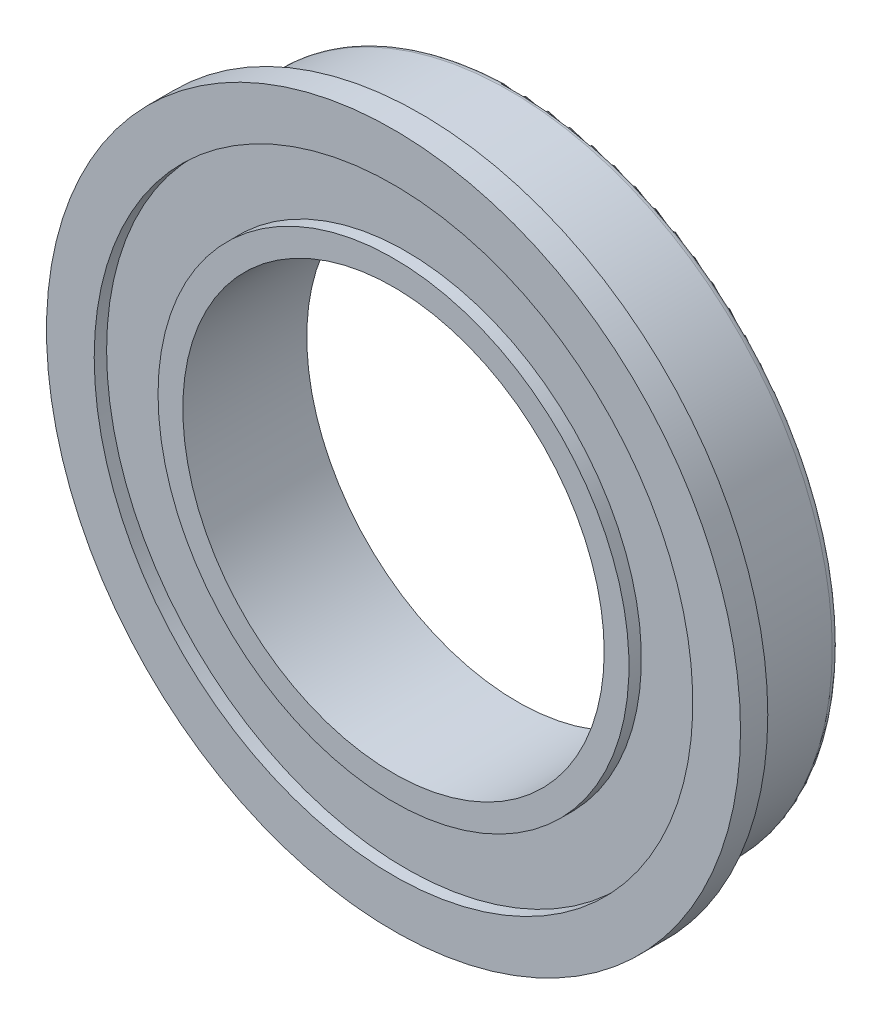
ISO-10303-21;
HEADER;
FILE_DESCRIPTION(('STEP AP214'),'2;1');
FILE_NAME('part.step','',(''),(''),'','','');
FILE_SCHEMA(('AUTOMOTIVE_DESIGN { 1 0 10303 214 1 1 1 1 }'));
ENDSEC;
DATA;
#1=APPLICATION_CONTEXT('core data for automotive mechanical design processes');
#2=APPLICATION_PROTOCOL_DEFINITION('international standard','automotive_design',2000,#1);
#3=PRODUCT_CONTEXT('',#1,'mechanical');
#4=PRODUCT('Part','Part','',(#3));
#5=PRODUCT_RELATED_PRODUCT_CATEGORY('part','',(#4));
#6=PRODUCT_DEFINITION_FORMATION('','',#4);
#7=PRODUCT_DEFINITION_CONTEXT('part definition',#1,'design');
#8=PRODUCT_DEFINITION('design','',#6,#7);
#9=PRODUCT_DEFINITION_SHAPE('','',#8);
#10=(LENGTH_UNIT() NAMED_UNIT(*) SI_UNIT(.MILLI.,.METRE.));
#11=(NAMED_UNIT(*) PLANE_ANGLE_UNIT() SI_UNIT($,.RADIAN.));
#12=(NAMED_UNIT(*) SI_UNIT($,.STERADIAN.) SOLID_ANGLE_UNIT());
#13=UNCERTAINTY_MEASURE_WITH_UNIT(LENGTH_MEASURE(1.E-05),#10,'distance_accuracy_value','');
#14=(GEOMETRIC_REPRESENTATION_CONTEXT(3) GLOBAL_UNCERTAINTY_ASSIGNED_CONTEXT((#13)) GLOBAL_UNIT_ASSIGNED_CONTEXT((#10,
#11,#12)) REPRESENTATION_CONTEXT('',''));
#15=CARTESIAN_POINT('',(0.,0.,0.));
#16=DIRECTION('',(0.,0.,1.));
#17=DIRECTION('',(1.,0.,0.));
#18=AXIS2_PLACEMENT_3D('',#15,#16,#17);
#19=CARTESIAN_POINT('',(0.,0.,5.));
#20=DIRECTION('',(0.,0.,-1.));
#21=DIRECTION('',(-1.,0.,0.));
#22=AXIS2_PLACEMENT_3D('',#19,#20,#21);
#23=CYLINDRICAL_SURFACE('',#22,13.);
#24=CARTESIAN_POINT('',(0.,0.,0.3));
#25=DIRECTION('',(0.,0.,1.));
#26=DIRECTION('',(1.,0.,0.));
#27=AXIS2_PLACEMENT_3D('',#24,#25,#26);
#28=CIRCLE('',#27,13.);
#29=CARTESIAN_POINT('',(13.,0.,0.3));
#30=VERTEX_POINT('',#29);
#31=EDGE_CURVE('E40',#30,#30,#28,.T.);
#32=ORIENTED_EDGE('',*,*,#31,.T.);
#33=EDGE_LOOP('',(#32));
#34=FACE_BOUND('',#33,.T.);
#35=CARTESIAN_POINT('',(0.,0.,3.9));
#36=DIRECTION('',(0.,0.,1.));
#37=DIRECTION('',(1.,0.,0.));
#38=AXIS2_PLACEMENT_3D('',#35,#36,#37);
#39=CIRCLE('',#38,13.);
#40=CARTESIAN_POINT('',(13.,0.,3.9));
#41=VERTEX_POINT('',#40);
#42=EDGE_CURVE('E44',#41,#41,#39,.T.);
#43=ORIENTED_EDGE('',*,*,#42,.F.);
#44=EDGE_LOOP('',(#43));
#45=FACE_BOUND('',#44,.T.);
#46=ADVANCED_FACE('F33',(#34,#45),#23,.T.);
#47=CARTESIAN_POINT('',(0.,0.,5.));
#48=DIRECTION('',(0.,0.,1.));
#49=DIRECTION('',(1.,0.,0.));
#50=AXIS2_PLACEMENT_3D('',#47,#48,#49);
#51=PLANE('',#50);
#52=CARTESIAN_POINT('',(0.,0.,5.));
#53=DIRECTION('',(0.,0.,-1.));
#54=DIRECTION('',(-1.,0.,0.));
#55=AXIS2_PLACEMENT_3D('',#52,#53,#54);
#56=CIRCLE('',#55,12.075);
#57=CARTESIAN_POINT('',(-12.075,0.,5.));
#58=VERTEX_POINT('',#57);
#59=EDGE_CURVE('E73',#58,#58,#56,.T.);
#60=ORIENTED_EDGE('',*,*,#59,.T.);
#61=EDGE_LOOP('',(#60));
#62=FACE_BOUND('',#61,.T.);
#63=CARTESIAN_POINT('',(0.,0.,5.));
#64=DIRECTION('',(0.,0.,1.));
#65=DIRECTION('',(1.,0.,0.));
#66=AXIS2_PLACEMENT_3D('',#63,#64,#65);
#67=CIRCLE('',#66,14.);
#68=CARTESIAN_POINT('',(14.,0.,5.));
#69=VERTEX_POINT('',#68);
#70=EDGE_CURVE('E57',#69,#69,#67,.T.);
#71=ORIENTED_EDGE('',*,*,#70,.T.);
#72=EDGE_LOOP('',(#71));
#73=FACE_BOUND('',#72,.T.);
#74=ADVANCED_FACE('F92',(#62,#73),#51,.T.);
#75=CARTESIAN_POINT('',(0.,0.,0.));
#76=DIRECTION('',(0.,0.,1.));
#77=DIRECTION('',(1.,0.,0.));
#78=AXIS2_PLACEMENT_3D('',#75,#76,#77);
#79=PLANE('',#78);
#80=CARTESIAN_POINT('',(0.,0.,0.));
#81=DIRECTION('',(0.,0.,-1.));
#82=DIRECTION('',(-1.,0.,0.));
#83=AXIS2_PLACEMENT_3D('',#80,#81,#82);
#84=CIRCLE('',#83,12.075);
#85=CARTESIAN_POINT('',(-12.075,0.,0.));
#86=VERTEX_POINT('',#85);
#87=EDGE_CURVE('E66',#86,#86,#84,.T.);
#88=ORIENTED_EDGE('',*,*,#87,.F.);
#89=EDGE_LOOP('',(#88));
#90=FACE_BOUND('',#89,.T.);
#91=CARTESIAN_POINT('',(0.,0.,0.));
#92=DIRECTION('',(0.,0.,1.));
#93=DIRECTION('',(1.,0.,0.));
#94=AXIS2_PLACEMENT_3D('',#91,#92,#93);
#95=CIRCLE('',#94,12.7);
#96=CARTESIAN_POINT('',(12.7,0.,0.));
#97=VERTEX_POINT('',#96);
#98=EDGE_CURVE('E10',#97,#97,#95,.F.);
#99=ORIENTED_EDGE('',*,*,#98,.T.);
#100=EDGE_LOOP('',(#99));
#101=FACE_BOUND('',#100,.T.);
#102=ADVANCED_FACE('F89',(#90,#101),#79,.F.);
#103=CARTESIAN_POINT('',(0.,0.,3.9));
#104=DIRECTION('',(0.,0.,1.));
#105=DIRECTION('',(1.,0.,0.));
#106=AXIS2_PLACEMENT_3D('',#103,#104,#105);
#107=CYLINDRICAL_SURFACE('',#106,14.);
#108=CARTESIAN_POINT('',(0.,0.,3.9));
#109=DIRECTION('',(0.,0.,1.));
#110=DIRECTION('',(1.,0.,0.));
#111=AXIS2_PLACEMENT_3D('',#108,#109,#110);
#112=CIRCLE('',#111,14.);
#113=CARTESIAN_POINT('',(14.,0.,3.9));
#114=VERTEX_POINT('',#113);
#115=EDGE_CURVE('E54',#114,#114,#112,.T.);
#116=ORIENTED_EDGE('',*,*,#115,.T.);
#117=EDGE_LOOP('',(#116));
#118=FACE_BOUND('',#117,.T.);
#119=ORIENTED_EDGE('',*,*,#70,.F.);
#120=EDGE_LOOP('',(#119));
#121=FACE_BOUND('',#120,.T.);
#122=ADVANCED_FACE('F91',(#118,#121),#107,.T.);
#123=CARTESIAN_POINT('',(0.,0.,3.9));
#124=DIRECTION('',(0.,0.,1.));
#125=DIRECTION('',(1.,0.,0.));
#126=AXIS2_PLACEMENT_3D('',#123,#124,#125);
#127=PLANE('',#126);
#128=ORIENTED_EDGE('',*,*,#42,.T.);
#129=EDGE_LOOP('',(#128));
#130=FACE_BOUND('',#129,.T.);
#131=ORIENTED_EDGE('',*,*,#115,.F.);
#132=EDGE_LOOP('',(#131));
#133=FACE_BOUND('',#132,.T.);
#134=ADVANCED_FACE('F100',(#130,#133),#127,.F.);
#135=CARTESIAN_POINT('',(0.,0.,0.3));
#136=DIRECTION('',(0.,0.,1.));
#137=DIRECTION('',(1.,0.,0.));
#138=AXIS2_PLACEMENT_3D('',#135,#136,#137);
#139=TOROIDAL_SURFACE('',#138,12.7,0.3);
#140=ORIENTED_EDGE('',*,*,#98,.F.);
#141=EDGE_LOOP('',(#140));
#142=FACE_BOUND('',#141,.T.);
#143=ORIENTED_EDGE('',*,*,#31,.F.);
#144=EDGE_LOOP('',(#143));
#145=FACE_BOUND('',#144,.T.);
#146=ADVANCED_FACE('F35',(#142,#145),#139,.T.);
#147=CARTESIAN_POINT('',(0.,0.,0.));
#148=DIRECTION('',(0.,0.,-1.));
#149=DIRECTION('',(-1.,0.,0.));
#150=AXIS2_PLACEMENT_3D('',#147,#148,#149);
#151=CYLINDRICAL_SURFACE('',#150,9.5);
#152=CARTESIAN_POINT('',(0.,0.,0.));
#153=DIRECTION('',(0.,0.,-1.));
#154=DIRECTION('',(-1.,0.,0.));
#155=AXIS2_PLACEMENT_3D('',#152,#153,#154);
#156=CIRCLE('',#155,9.5);
#157=CARTESIAN_POINT('',(-9.5,0.,0.));
#158=VERTEX_POINT('',#157);
#159=EDGE_CURVE('E60',#158,#158,#156,.T.);
#160=ORIENTED_EDGE('',*,*,#159,.F.);
#161=EDGE_LOOP('',(#160));
#162=FACE_BOUND('',#161,.T.);
#163=CARTESIAN_POINT('',(0.,0.,0.5));
#164=DIRECTION('',(0.,0.,-1.));
#165=DIRECTION('',(-1.,0.,0.));
#166=AXIS2_PLACEMENT_3D('',#163,#164,#165);
#167=CIRCLE('',#166,9.5);
#168=CARTESIAN_POINT('',(-9.5,0.,0.5));
#169=VERTEX_POINT('',#168);
#170=EDGE_CURVE('E78',#169,#169,#167,.T.);
#171=ORIENTED_EDGE('',*,*,#170,.T.);
#172=EDGE_LOOP('',(#171));
#173=FACE_BOUND('',#172,.T.);
#174=ADVANCED_FACE('F127',(#162,#173),#151,.T.);
#175=CARTESIAN_POINT('',(0.,9.5,0.5));
#176=DIRECTION('',(0.,0.,1.));
#177=DIRECTION('',(1.,0.,0.));
#178=AXIS2_PLACEMENT_3D('',#175,#176,#177);
#179=PLANE('',#178);
#180=ORIENTED_EDGE('',*,*,#170,.F.);
#181=EDGE_LOOP('',(#180));
#182=FACE_BOUND('',#181,.T.);
#183=CARTESIAN_POINT('',(0.,0.,0.5));
#184=DIRECTION('',(0.,0.,-1.));
#185=DIRECTION('',(-1.,0.,0.));
#186=AXIS2_PLACEMENT_3D('',#183,#184,#185);
#187=CIRCLE('',#186,12.075);
#188=CARTESIAN_POINT('',(-12.075,0.,0.5));
#189=VERTEX_POINT('',#188);
#190=EDGE_CURVE('E81',#189,#189,#187,.T.);
#191=ORIENTED_EDGE('',*,*,#190,.T.);
#192=EDGE_LOOP('',(#191));
#193=FACE_BOUND('',#192,.T.);
#194=ADVANCED_FACE('F147',(#182,#193),#179,.F.);
#195=CARTESIAN_POINT('',(0.,0.,0.));
#196=DIRECTION('',(0.,0.,-1.));
#197=DIRECTION('',(-1.,0.,0.));
#198=AXIS2_PLACEMENT_3D('',#195,#196,#197);
#199=CYLINDRICAL_SURFACE('',#198,12.075);
#200=ORIENTED_EDGE('',*,*,#190,.F.);
#201=EDGE_LOOP('',(#200));
#202=FACE_BOUND('',#201,.T.);
#203=ORIENTED_EDGE('',*,*,#87,.T.);
#204=EDGE_LOOP('',(#203));
#205=FACE_BOUND('',#204,.T.);
#206=ADVANCED_FACE('F87',(#202,#205),#199,.F.);
#207=CARTESIAN_POINT('',(0.,0.,5.));
#208=DIRECTION('',(0.,0.,-1.));
#209=DIRECTION('',(-1.,0.,0.));
#210=AXIS2_PLACEMENT_3D('',#207,#208,#209);
#211=CIRCLE('',#210,9.5);
#212=CARTESIAN_POINT('',(-9.5,0.,5.));
#213=VERTEX_POINT('',#212);
#214=EDGE_CURVE('E63',#213,#213,#211,.T.);
#215=ORIENTED_EDGE('',*,*,#214,.F.);
#216=EDGE_LOOP('',(#215));
#217=FACE_BOUND('',#216,.T.);
#218=CARTESIAN_POINT('',(0.,0.,5.));
#219=DIRECTION('',(0.,0.,1.));
#220=DIRECTION('',(1.,0.,0.));
#221=AXIS2_PLACEMENT_3D('',#218,#219,#220);
#222=CIRCLE('',#221,8.5);
#223=CARTESIAN_POINT('',(8.5,0.,5.));
#224=VERTEX_POINT('',#223);
#225=EDGE_CURVE('E48',#224,#224,#222,.T.);
#226=ORIENTED_EDGE('',*,*,#225,.F.);
#227=EDGE_LOOP('',(#226));
#228=FACE_BOUND('',#227,.T.);
#229=ADVANCED_FACE('F105',(#217,#228),#51,.T.);
#230=CARTESIAN_POINT('',(0.,0.,5.));
#231=DIRECTION('',(0.,0.,-1.));
#232=DIRECTION('',(-1.,0.,0.));
#233=AXIS2_PLACEMENT_3D('',#230,#231,#232);
#234=CYLINDRICAL_SURFACE('',#233,8.5);
#235=ORIENTED_EDGE('',*,*,#225,.T.);
#236=EDGE_LOOP('',(#235));
#237=FACE_BOUND('',#236,.T.);
#238=CARTESIAN_POINT('',(0.,0.,0.));
#239=DIRECTION('',(0.,0.,1.));
#240=DIRECTION('',(1.,0.,0.));
#241=AXIS2_PLACEMENT_3D('',#238,#239,#240);
#242=CIRCLE('',#241,8.5);
#243=CARTESIAN_POINT('',(8.5,0.,0.));
#244=VERTEX_POINT('',#243);
#245=EDGE_CURVE('E51',#244,#244,#242,.T.);
#246=ORIENTED_EDGE('',*,*,#245,.F.);
#247=EDGE_LOOP('',(#246));
#248=FACE_BOUND('',#247,.T.);
#249=ADVANCED_FACE('F108',(#237,#248),#234,.F.);
#250=ORIENTED_EDGE('',*,*,#159,.T.);
#251=EDGE_LOOP('',(#250));
#252=FACE_BOUND('',#251,.T.);
#253=ORIENTED_EDGE('',*,*,#245,.T.);
#254=EDGE_LOOP('',(#253));
#255=FACE_BOUND('',#254,.T.);
#256=ADVANCED_FACE('F94',(#252,#255),#79,.F.);
#257=CARTESIAN_POINT('',(0.,0.,0.));
#258=DIRECTION('',(0.,0.,-1.));
#259=DIRECTION('',(-1.,0.,0.));
#260=AXIS2_PLACEMENT_3D('',#257,#258,#259);
#261=CYLINDRICAL_SURFACE('',#260,9.5);
#262=CARTESIAN_POINT('',(0.,0.,4.5));
#263=DIRECTION('',(0.,0.,-1.));
#264=DIRECTION('',(-1.,0.,0.));
#265=AXIS2_PLACEMENT_3D('',#262,#263,#264);
#266=CIRCLE('',#265,9.5);
#267=CARTESIAN_POINT('',(-9.5,0.,4.5));
#268=VERTEX_POINT('',#267);
#269=EDGE_CURVE('E67',#268,#268,#266,.T.);
#270=ORIENTED_EDGE('',*,*,#269,.F.);
#271=EDGE_LOOP('',(#270));
#272=FACE_BOUND('',#271,.T.);
#273=ORIENTED_EDGE('',*,*,#214,.T.);
#274=EDGE_LOOP('',(#273));
#275=FACE_BOUND('',#274,.T.);
#276=ADVANCED_FACE('F107',(#272,#275),#261,.T.);
#277=CARTESIAN_POINT('',(0.,9.5,4.5));
#278=DIRECTION('',(0.,0.,-1.));
#279=DIRECTION('',(-1.,0.,0.));
#280=AXIS2_PLACEMENT_3D('',#277,#278,#279);
#281=PLANE('',#280);
#282=CARTESIAN_POINT('',(0.,0.,4.5));
#283=DIRECTION('',(0.,0.,-1.));
#284=DIRECTION('',(-1.,0.,0.));
#285=AXIS2_PLACEMENT_3D('',#282,#283,#284);
#286=CIRCLE('',#285,12.075);
#287=CARTESIAN_POINT('',(-12.075,0.,4.5));
#288=VERTEX_POINT('',#287);
#289=EDGE_CURVE('E70',#288,#288,#286,.T.);
#290=ORIENTED_EDGE('',*,*,#289,.F.);
#291=EDGE_LOOP('',(#290));
#292=FACE_BOUND('',#291,.T.);
#293=ORIENTED_EDGE('',*,*,#269,.T.);
#294=EDGE_LOOP('',(#293));
#295=FACE_BOUND('',#294,.T.);
#296=ADVANCED_FACE('F153',(#292,#295),#281,.F.);
#297=CARTESIAN_POINT('',(0.,0.,0.));
#298=DIRECTION('',(0.,0.,-1.));
#299=DIRECTION('',(-1.,0.,0.));
#300=AXIS2_PLACEMENT_3D('',#297,#298,#299);
#301=CYLINDRICAL_SURFACE('',#300,12.075);
#302=ORIENTED_EDGE('',*,*,#59,.F.);
#303=EDGE_LOOP('',(#302));
#304=FACE_BOUND('',#303,.T.);
#305=ORIENTED_EDGE('',*,*,#289,.T.);
#306=EDGE_LOOP('',(#305));
#307=FACE_BOUND('',#306,.T.);
#308=ADVANCED_FACE('F158',(#304,#307),#301,.F.);
#309=CLOSED_SHELL('',(#46,#74,#102,#122,#134,#146,#174,#194,#206,#229,#249,#256,#276,#296,#308));
#310=MANIFOLD_SOLID_BREP('B2',#309);
#311=ADVANCED_BREP_SHAPE_REPRESENTATION('',(#18,#310),#14);
#312=SHAPE_DEFINITION_REPRESENTATION(#9,#311);
ENDSEC;
END-ISO-10303-21;
